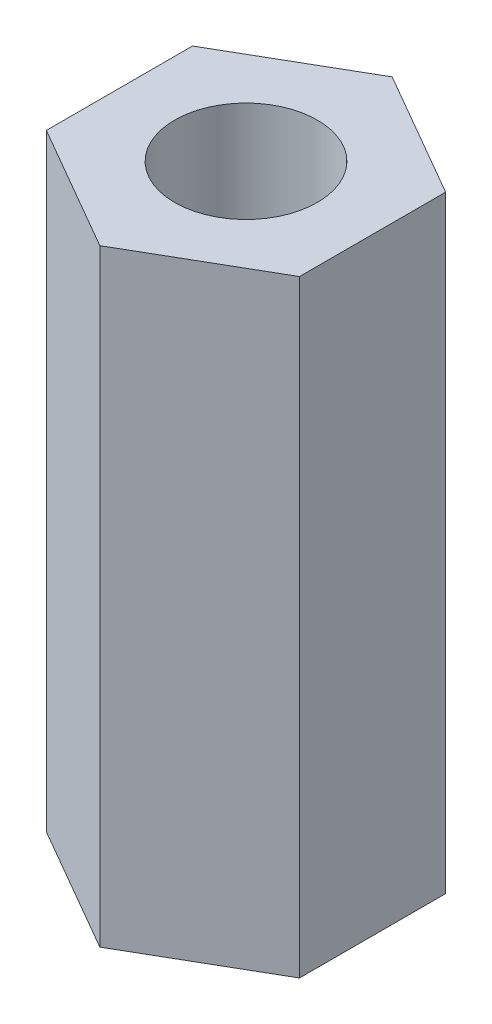
ISO-10303-21;
HEADER;
FILE_DESCRIPTION(('STEP AP214'),'2;1');
FILE_NAME('part.step','',(''),(''),'','','');
FILE_SCHEMA(('AUTOMOTIVE_DESIGN { 1 0 10303 214 1 1 1 1 }'));
ENDSEC;
DATA;
#1=APPLICATION_CONTEXT('core data for automotive mechanical design processes');
#2=APPLICATION_PROTOCOL_DEFINITION('international standard','automotive_design',2000,#1);
#3=PRODUCT_CONTEXT('',#1,'mechanical');
#4=PRODUCT('Part','Part','',(#3));
#5=PRODUCT_RELATED_PRODUCT_CATEGORY('part','',(#4));
#6=PRODUCT_DEFINITION_FORMATION('','',#4);
#7=PRODUCT_DEFINITION_CONTEXT('part definition',#1,'design');
#8=PRODUCT_DEFINITION('design','',#6,#7);
#9=PRODUCT_DEFINITION_SHAPE('','',#8);
#10=(LENGTH_UNIT() NAMED_UNIT(*) SI_UNIT(.MILLI.,.METRE.));
#11=(NAMED_UNIT(*) PLANE_ANGLE_UNIT() SI_UNIT($,.RADIAN.));
#12=(NAMED_UNIT(*) SI_UNIT($,.STERADIAN.) SOLID_ANGLE_UNIT());
#13=UNCERTAINTY_MEASURE_WITH_UNIT(LENGTH_MEASURE(1.E-05),#10,'distance_accuracy_value','');
#14=(GEOMETRIC_REPRESENTATION_CONTEXT(3) GLOBAL_UNCERTAINTY_ASSIGNED_CONTEXT((#13)) GLOBAL_UNIT_ASSIGNED_CONTEXT((#10,
#11,#12)) REPRESENTATION_CONTEXT('',''));
#15=CARTESIAN_POINT('',(0.,0.,0.));
#16=DIRECTION('',(0.,0.,1.));
#17=DIRECTION('',(1.,0.,0.));
#18=AXIS2_PLACEMENT_3D('',#15,#16,#17);
#19=CARTESIAN_POINT('',(0.,12.,0.));
#20=DIRECTION('',(0.,-1.,0.));
#21=DIRECTION('',(0.,0.,-1.));
#22=AXIS2_PLACEMENT_3D('',#19,#20,#21);
#23=PLANE('',#22);
#24=DIRECTION('',(-0.866025403784438,0.,0.5));
#25=VECTOR('',#24,1.);
#26=CARTESIAN_POINT('',(-2.50021534072567,12.,-1.4435));
#27=LINE('',#26,#25);
#28=CARTESIAN_POINT('',(0.,12.,-2.887));
#29=VERTEX_POINT('',#28);
#30=CARTESIAN_POINT('',(-2.50021534072567,12.,-1.4435));
#31=VERTEX_POINT('',#30);
#32=EDGE_CURVE('E128',#29,#31,#27,.T.);
#33=ORIENTED_EDGE('',*,*,#32,.T.);
#34=DIRECTION('',(0.,0.,1.));
#35=VECTOR('',#34,1.);
#36=CARTESIAN_POINT('',(-2.50021534072567,12.,1.4435));
#37=LINE('',#36,#35);
#38=CARTESIAN_POINT('',(-2.50021534072567,12.,1.4435));
#39=VERTEX_POINT('',#38);
#40=EDGE_CURVE('E86',#31,#39,#37,.T.);
#41=ORIENTED_EDGE('',*,*,#40,.T.);
#42=DIRECTION('',(0.866025403784438,0.,0.5));
#43=VECTOR('',#42,1.);
#44=CARTESIAN_POINT('',(0.,12.,2.887));
#45=LINE('',#44,#43);
#46=CARTESIAN_POINT('',(0.,12.,2.887));
#47=VERTEX_POINT('',#46);
#48=EDGE_CURVE('E99',#39,#47,#45,.T.);
#49=ORIENTED_EDGE('',*,*,#48,.T.);
#50=DIRECTION('',(0.866025403784439,0.,-0.5));
#51=VECTOR('',#50,1.);
#52=CARTESIAN_POINT('',(2.50021534072567,12.,1.4435));
#53=LINE('',#52,#51);
#54=CARTESIAN_POINT('',(2.50021534072567,12.,1.4435));
#55=VERTEX_POINT('',#54);
#56=EDGE_CURVE('E93',#47,#55,#53,.T.);
#57=ORIENTED_EDGE('',*,*,#56,.T.);
#58=DIRECTION('',(0.,0.,-1.));
#59=VECTOR('',#58,1.);
#60=CARTESIAN_POINT('',(2.50021534072567,12.,-1.4435));
#61=LINE('',#60,#59);
#62=CARTESIAN_POINT('',(2.50021534072567,12.,-1.4435));
#63=VERTEX_POINT('',#62);
#64=EDGE_CURVE('E97',#55,#63,#61,.T.);
#65=ORIENTED_EDGE('',*,*,#64,.T.);
#66=DIRECTION('',(-0.866025403784439,0.,-0.5));
#67=VECTOR('',#66,1.);
#68=CARTESIAN_POINT('',(0.,12.,-2.887));
#69=LINE('',#68,#67);
#70=EDGE_CURVE('E49',#63,#29,#69,.T.);
#71=ORIENTED_EDGE('',*,*,#70,.T.);
#72=EDGE_LOOP('',(#33,#41,#49,#57,#65,#71));
#73=FACE_BOUND('',#72,.T.);
#74=CARTESIAN_POINT('',(0.,12.,0.));
#75=DIRECTION('',(0.,1.,0.));
#76=DIRECTION('',(0.,0.,1.));
#77=AXIS2_PLACEMENT_3D('',#74,#75,#76);
#78=CIRCLE('',#77,1.41);
#79=CARTESIAN_POINT('',(0.,12.,1.41));
#80=VERTEX_POINT('',#79);
#81=EDGE_CURVE('E121',#80,#80,#78,.T.);
#82=ORIENTED_EDGE('',*,*,#81,.F.);
#83=EDGE_LOOP('',(#82));
#84=FACE_BOUND('',#83,.T.);
#85=ADVANCED_FACE('F32',(#73,#84),#23,.F.);
#86=CARTESIAN_POINT('',(0.,0.,0.));
#87=DIRECTION('',(0.,-1.,0.));
#88=DIRECTION('',(0.,0.,-1.));
#89=AXIS2_PLACEMENT_3D('',#86,#87,#88);
#90=PLANE('',#89);
#91=DIRECTION('',(-0.866025403784438,0.,0.5));
#92=VECTOR('',#91,1.);
#93=CARTESIAN_POINT('',(-2.50021534072567,0.,-1.4435));
#94=LINE('',#93,#92);
#95=CARTESIAN_POINT('',(0.,0.,-2.887));
#96=VERTEX_POINT('',#95);
#97=CARTESIAN_POINT('',(-2.50021534072567,0.,-1.4435));
#98=VERTEX_POINT('',#97);
#99=EDGE_CURVE('E117',#96,#98,#94,.T.);
#100=ORIENTED_EDGE('',*,*,#99,.F.);
#101=DIRECTION('',(-0.866025403784439,0.,-0.5));
#102=VECTOR('',#101,1.);
#103=CARTESIAN_POINT('',(0.,0.,-2.887));
#104=LINE('',#103,#102);
#105=CARTESIAN_POINT('',(2.50021534072567,0.,-1.4435));
#106=VERTEX_POINT('',#105);
#107=EDGE_CURVE('E78',#106,#96,#104,.T.);
#108=ORIENTED_EDGE('',*,*,#107,.F.);
#109=DIRECTION('',(0.,0.,-1.));
#110=VECTOR('',#109,1.);
#111=CARTESIAN_POINT('',(2.50021534072567,0.,-1.4435));
#112=LINE('',#111,#110);
#113=CARTESIAN_POINT('',(2.50021534072567,0.,1.4435));
#114=VERTEX_POINT('',#113);
#115=EDGE_CURVE('E72',#114,#106,#112,.T.);
#116=ORIENTED_EDGE('',*,*,#115,.F.);
#117=DIRECTION('',(0.866025403784439,0.,-0.5));
#118=VECTOR('',#117,1.);
#119=CARTESIAN_POINT('',(2.50021534072567,0.,1.4435));
#120=LINE('',#119,#118);
#121=CARTESIAN_POINT('',(0.,0.,2.887));
#122=VERTEX_POINT('',#121);
#123=EDGE_CURVE('E107',#122,#114,#120,.T.);
#124=ORIENTED_EDGE('',*,*,#123,.F.);
#125=DIRECTION('',(0.866025403784438,0.,0.5));
#126=VECTOR('',#125,1.);
#127=CARTESIAN_POINT('',(0.,0.,2.887));
#128=LINE('',#127,#126);
#129=CARTESIAN_POINT('',(-2.50021534072567,0.,1.4435));
#130=VERTEX_POINT('',#129);
#131=EDGE_CURVE('E123',#130,#122,#128,.T.);
#132=ORIENTED_EDGE('',*,*,#131,.F.);
#133=DIRECTION('',(0.,0.,1.));
#134=VECTOR('',#133,1.);
#135=CARTESIAN_POINT('',(-2.50021534072567,0.,1.4435));
#136=LINE('',#135,#134);
#137=EDGE_CURVE('E120',#98,#130,#136,.T.);
#138=ORIENTED_EDGE('',*,*,#137,.F.);
#139=EDGE_LOOP('',(#100,#108,#116,#124,#132,#138));
#140=FACE_BOUND('',#139,.T.);
#141=CARTESIAN_POINT('',(0.,0.,0.));
#142=DIRECTION('',(0.,1.,0.));
#143=DIRECTION('',(0.,0.,1.));
#144=AXIS2_PLACEMENT_3D('',#141,#142,#143);
#145=CIRCLE('',#144,1.41);
#146=CARTESIAN_POINT('',(0.,0.,1.41));
#147=VERTEX_POINT('',#146);
#148=EDGE_CURVE('E221',#147,#147,#145,.T.);
#149=ORIENTED_EDGE('',*,*,#148,.T.);
#150=EDGE_LOOP('',(#149));
#151=FACE_BOUND('',#150,.T.);
#152=ADVANCED_FACE('F137',(#140,#151),#90,.T.);
#153=CARTESIAN_POINT('',(-2.50021534072567,12.,-1.4435));
#154=DIRECTION('',(0.5,0.,0.866025403784439));
#155=DIRECTION('',(0.866025403784439,0.,-0.5));
#156=AXIS2_PLACEMENT_3D('',#153,#154,#155);
#157=PLANE('',#156);
#158=ORIENTED_EDGE('',*,*,#99,.T.);
#159=DIRECTION('',(0.,-1.,0.));
#160=VECTOR('',#159,1.);
#161=CARTESIAN_POINT('',(-2.50021534072567,12.,-1.4435));
#162=LINE('',#161,#160);
#163=EDGE_CURVE('E11',#31,#98,#162,.T.);
#164=ORIENTED_EDGE('',*,*,#163,.F.);
#165=ORIENTED_EDGE('',*,*,#32,.F.);
#166=DIRECTION('',(0.,-1.,0.));
#167=VECTOR('',#166,1.);
#168=CARTESIAN_POINT('',(0.,12.,-2.887));
#169=LINE('',#168,#167);
#170=EDGE_CURVE('E113',#29,#96,#169,.T.);
#171=ORIENTED_EDGE('',*,*,#170,.T.);
#172=EDGE_LOOP('',(#158,#164,#165,#171));
#173=FACE_BOUND('',#172,.T.);
#174=ADVANCED_FACE('F34',(#173),#157,.F.);
#175=CARTESIAN_POINT('',(-2.50021534072567,12.,1.4435));
#176=DIRECTION('',(1.,0.,0.));
#177=DIRECTION('',(0.,0.,-1.));
#178=AXIS2_PLACEMENT_3D('',#175,#176,#177);
#179=PLANE('',#178);
#180=ORIENTED_EDGE('',*,*,#137,.T.);
#181=DIRECTION('',(0.,-1.,0.));
#182=VECTOR('',#181,1.);
#183=CARTESIAN_POINT('',(-2.50021534072567,12.,1.4435));
#184=LINE('',#183,#182);
#185=EDGE_CURVE('E41',#39,#130,#184,.T.);
#186=ORIENTED_EDGE('',*,*,#185,.F.);
#187=ORIENTED_EDGE('',*,*,#40,.F.);
#188=ORIENTED_EDGE('',*,*,#163,.T.);
#189=EDGE_LOOP('',(#180,#186,#187,#188));
#190=FACE_BOUND('',#189,.T.);
#191=ADVANCED_FACE('F162',(#190),#179,.F.);
#192=CARTESIAN_POINT('',(0.,12.,2.887));
#193=DIRECTION('',(0.5,0.,-0.866025403784439));
#194=DIRECTION('',(-0.866025403784439,0.,-0.5));
#195=AXIS2_PLACEMENT_3D('',#192,#193,#194);
#196=PLANE('',#195);
#197=ORIENTED_EDGE('',*,*,#131,.T.);
#198=DIRECTION('',(0.,-1.,0.));
#199=VECTOR('',#198,1.);
#200=CARTESIAN_POINT('',(0.,12.,2.887));
#201=LINE('',#200,#199);
#202=EDGE_CURVE('E108',#47,#122,#201,.T.);
#203=ORIENTED_EDGE('',*,*,#202,.F.);
#204=ORIENTED_EDGE('',*,*,#48,.F.);
#205=ORIENTED_EDGE('',*,*,#185,.T.);
#206=EDGE_LOOP('',(#197,#203,#204,#205));
#207=FACE_BOUND('',#206,.T.);
#208=ADVANCED_FACE('F134',(#207),#196,.F.);
#209=CARTESIAN_POINT('',(2.50021534072567,12.,1.4435));
#210=DIRECTION('',(-0.5,0.,-0.866025403784439));
#211=DIRECTION('',(-0.866025403784439,0.,0.5));
#212=AXIS2_PLACEMENT_3D('',#209,#210,#211);
#213=PLANE('',#212);
#214=ORIENTED_EDGE('',*,*,#123,.T.);
#215=DIRECTION('',(0.,-1.,0.));
#216=VECTOR('',#215,1.);
#217=CARTESIAN_POINT('',(2.50021534072567,12.,1.4435));
#218=LINE('',#217,#216);
#219=EDGE_CURVE('E104',#55,#114,#218,.T.);
#220=ORIENTED_EDGE('',*,*,#219,.F.);
#221=ORIENTED_EDGE('',*,*,#56,.F.);
#222=ORIENTED_EDGE('',*,*,#202,.T.);
#223=EDGE_LOOP('',(#214,#220,#221,#222));
#224=FACE_BOUND('',#223,.T.);
#225=ADVANCED_FACE('F105',(#224),#213,.F.);
#226=CARTESIAN_POINT('',(2.50021534072567,12.,-1.4435));
#227=DIRECTION('',(-1.,0.,0.));
#228=DIRECTION('',(0.,0.,1.));
#229=AXIS2_PLACEMENT_3D('',#226,#227,#228);
#230=PLANE('',#229);
#231=ORIENTED_EDGE('',*,*,#115,.T.);
#232=DIRECTION('',(0.,-1.,0.));
#233=VECTOR('',#232,1.);
#234=CARTESIAN_POINT('',(2.50021534072567,12.,-1.4435));
#235=LINE('',#234,#233);
#236=EDGE_CURVE('E109',#63,#106,#235,.T.);
#237=ORIENTED_EDGE('',*,*,#236,.F.);
#238=ORIENTED_EDGE('',*,*,#64,.F.);
#239=ORIENTED_EDGE('',*,*,#219,.T.);
#240=EDGE_LOOP('',(#231,#237,#238,#239));
#241=FACE_BOUND('',#240,.T.);
#242=ADVANCED_FACE('F111',(#241),#230,.F.);
#243=CARTESIAN_POINT('',(0.,12.,-2.887));
#244=DIRECTION('',(-0.5,0.,0.866025403784439));
#245=DIRECTION('',(0.866025403784439,0.,0.5));
#246=AXIS2_PLACEMENT_3D('',#243,#244,#245);
#247=PLANE('',#246);
#248=ORIENTED_EDGE('',*,*,#107,.T.);
#249=ORIENTED_EDGE('',*,*,#170,.F.);
#250=ORIENTED_EDGE('',*,*,#70,.F.);
#251=ORIENTED_EDGE('',*,*,#236,.T.);
#252=EDGE_LOOP('',(#248,#249,#250,#251));
#253=FACE_BOUND('',#252,.T.);
#254=ADVANCED_FACE('F142',(#253),#247,.F.);
#255=CARTESIAN_POINT('',(0.,12.,0.));
#256=DIRECTION('',(0.,-1.,0.));
#257=DIRECTION('',(0.,0.,-1.));
#258=AXIS2_PLACEMENT_3D('',#255,#256,#257);
#259=CYLINDRICAL_SURFACE('',#258,1.41);
#260=ORIENTED_EDGE('',*,*,#81,.T.);
#261=EDGE_LOOP('',(#260));
#262=FACE_BOUND('',#261,.T.);
#263=ORIENTED_EDGE('',*,*,#148,.F.);
#264=EDGE_LOOP('',(#263));
#265=FACE_BOUND('',#264,.T.);
#266=ADVANCED_FACE('F144',(#262,#265),#259,.F.);
#267=CLOSED_SHELL('',(#85,#152,#174,#191,#208,#225,#242,#254,#266));
#268=MANIFOLD_SOLID_BREP('B2',#267);
#269=ADVANCED_BREP_SHAPE_REPRESENTATION('',(#18,#268),#14);
#270=SHAPE_DEFINITION_REPRESENTATION(#9,#269);
ENDSEC;
END-ISO-10303-21;
